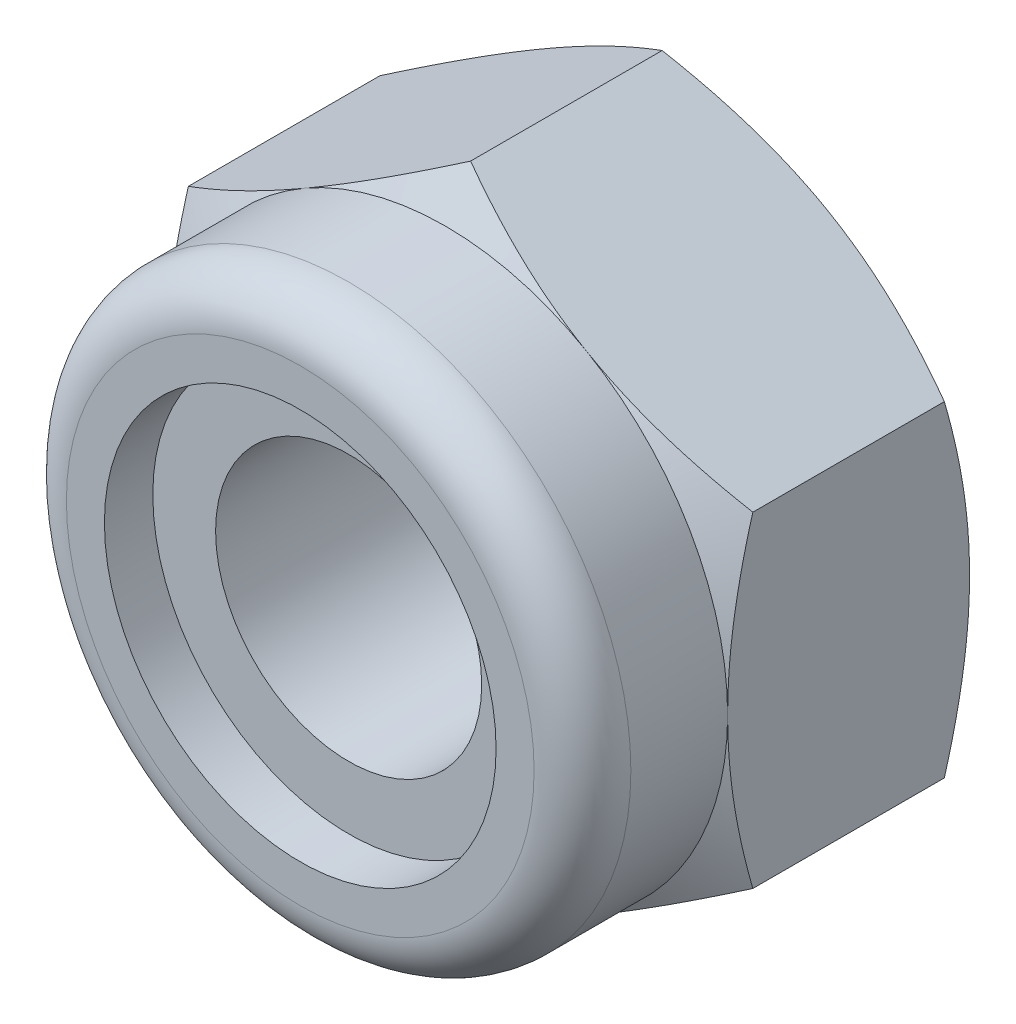
ISO-10303-21;
HEADER;
FILE_DESCRIPTION(('STEP AP214'),'2;1');
FILE_NAME('part.step','',(''),(''),'','','');
FILE_SCHEMA(('AUTOMOTIVE_DESIGN { 1 0 10303 214 1 1 1 1 }'));
ENDSEC;
DATA;
#1=APPLICATION_CONTEXT('core data for automotive mechanical design processes');
#2=APPLICATION_PROTOCOL_DEFINITION('international standard','automotive_design',2000,#1);
#3=PRODUCT_CONTEXT('',#1,'mechanical');
#4=PRODUCT('Part','Part','',(#3));
#5=PRODUCT_RELATED_PRODUCT_CATEGORY('part','',(#4));
#6=PRODUCT_DEFINITION_FORMATION('','',#4);
#7=PRODUCT_DEFINITION_CONTEXT('part definition',#1,'design');
#8=PRODUCT_DEFINITION('design','',#6,#7);
#9=PRODUCT_DEFINITION_SHAPE('','',#8);
#10=(LENGTH_UNIT() NAMED_UNIT(*) SI_UNIT(.MILLI.,.METRE.));
#11=(NAMED_UNIT(*) PLANE_ANGLE_UNIT() SI_UNIT($,.RADIAN.));
#12=(NAMED_UNIT(*) SI_UNIT($,.STERADIAN.) SOLID_ANGLE_UNIT());
#13=UNCERTAINTY_MEASURE_WITH_UNIT(LENGTH_MEASURE(1.E-05),#10,'distance_accuracy_value','');
#14=(GEOMETRIC_REPRESENTATION_CONTEXT(3) GLOBAL_UNCERTAINTY_ASSIGNED_CONTEXT((#13)) GLOBAL_UNIT_ASSIGNED_CONTEXT((#10,
#11,#12)) REPRESENTATION_CONTEXT('',''));
#15=CARTESIAN_POINT('',(0.,0.,0.));
#16=DIRECTION('',(0.,0.,1.));
#17=DIRECTION('',(1.,0.,0.));
#18=AXIS2_PLACEMENT_3D('',#15,#16,#17);
#19=CARTESIAN_POINT('',(-7.,0.,-3.));
#20=DIRECTION('',(0.,0.,1.));
#21=DIRECTION('',(1.,0.,0.));
#22=AXIS2_PLACEMENT_3D('',#19,#20,#21);
#23=PLANE('',#22);
#24=CARTESIAN_POINT('',(0.,0.,-3.));
#25=DIRECTION('',(0.,0.,1.));
#26=DIRECTION('',(1.,0.,0.));
#27=AXIS2_PLACEMENT_3D('',#24,#25,#26);
#28=CIRCLE('',#27,2.);
#29=CARTESIAN_POINT('',(2.,0.,-3.));
#30=VERTEX_POINT('',#29);
#31=EDGE_CURVE('E405',#30,#30,#28,.T.);
#32=ORIENTED_EDGE('',*,*,#31,.T.);
#33=EDGE_LOOP('',(#32));
#34=FACE_BOUND('',#33,.T.);
#35=CARTESIAN_POINT('',(0.,0.,-3.));
#36=DIRECTION('',(0.,0.,1.));
#37=DIRECTION('',(1.,0.,0.));
#38=AXIS2_PLACEMENT_3D('',#35,#36,#37);
#39=CIRCLE('',#38,3.5);
#40=CARTESIAN_POINT('',(3.5,0.,-3.));
#41=VERTEX_POINT('',#40);
#42=CARTESIAN_POINT('',(1.75,3.03108891324554,-3.));
#43=VERTEX_POINT('',#42);
#44=EDGE_CURVE('E409',#41,#43,#39,.T.);
#45=ORIENTED_EDGE('',*,*,#44,.F.);
#46=CARTESIAN_POINT('',(0.,0.,-3.));
#47=DIRECTION('',(0.,0.,1.));
#48=DIRECTION('',(1.,0.,0.));
#49=AXIS2_PLACEMENT_3D('',#46,#47,#48);
#50=CIRCLE('',#49,3.5);
#51=CARTESIAN_POINT('',(1.75,-3.03108891324554,-3.));
#52=VERTEX_POINT('',#51);
#53=EDGE_CURVE('E62',#41,#52,#50,.F.);
#54=ORIENTED_EDGE('',*,*,#53,.T.);
#55=CARTESIAN_POINT('',(-1.75,-3.03108891324554,-3.));
#56=VERTEX_POINT('',#55);
#57=EDGE_CURVE('E733',#52,#56,#50,.F.);
#58=ORIENTED_EDGE('',*,*,#57,.T.);
#59=CARTESIAN_POINT('',(-3.5,0.,-3.));
#60=VERTEX_POINT('',#59);
#61=EDGE_CURVE('E736',#56,#60,#50,.F.);
#62=ORIENTED_EDGE('',*,*,#61,.T.);
#63=CARTESIAN_POINT('',(-1.75,3.03108891324554,-3.));
#64=VERTEX_POINT('',#63);
#65=EDGE_CURVE('E739',#60,#64,#50,.F.);
#66=ORIENTED_EDGE('',*,*,#65,.T.);
#67=EDGE_CURVE('E220',#64,#43,#50,.F.);
#68=ORIENTED_EDGE('',*,*,#67,.T.);
#69=EDGE_LOOP('',(#45,#54,#58,#62,#66,#68));
#70=FACE_BOUND('',#69,.T.);
#71=ADVANCED_FACE('F39',(#34,#70),#23,.F.);
#72=CARTESIAN_POINT('',(0.,4.04145188432738,-3.));
#73=DIRECTION('',(-0.5,0.866025403784438,0.));
#74=DIRECTION('',(-0.866025403784439,-0.5,0.));
#75=AXIS2_PLACEMENT_3D('',#72,#73,#74);
#76=PLANE('',#75);
#77=DIRECTION('',(0.,0.,1.));
#78=VECTOR('',#77,1.);
#79=CARTESIAN_POINT('',(-3.5,2.02072594216369,-3.));
#80=LINE('',#79,#78);
#81=CARTESIAN_POINT('',(-3.5,2.02072594216369,-2.68739260883036));
#82=VERTEX_POINT('',#81);
#83=CARTESIAN_POINT('',(-3.5,2.02072594216369,-0.312607391169644));
#84=VERTEX_POINT('',#83);
#85=EDGE_CURVE('E247',#82,#84,#80,.T.);
#86=ORIENTED_EDGE('',*,*,#85,.T.);
#87=CARTESIAN_POINT('',(-3.5002,2.02061047210985,-0.312674060693372));
#88=CARTESIAN_POINT('',(-3.34639282154755,2.10941108799267,-0.261385788989985));
#89=CARTESIAN_POINT('',(-3.19125798916558,2.19897822522909,-0.214740953816198));
#90=CARTESIAN_POINT('',(-2.87830199342322,2.37966345361545,-0.13332187553335));
#91=CARTESIAN_POINT('',(-2.72047526921251,2.47078475532382,-0.0985764355845621));
#92=CARTESIAN_POINT('',(-2.40677778961987,2.65189807961074,-0.0444900271828369));
#93=CARTESIAN_POINT('',(-2.25095530083931,2.74186223545399,-0.0247890862603827));
#94=CARTESIAN_POINT('',(-1.93857711279463,2.92221386641056,-0.00127013273725483));
#95=CARTESIAN_POINT('',(-1.78202254896577,3.01260068598001,0.00256735545443531));
#96=CARTESIAN_POINT('',(-1.48949078007901,3.1814939814933,-0.00541530187697747));
#97=CARTESIAN_POINT('',(-1.35346978754209,3.26002573814993,-0.015275434069608));
#98=CARTESIAN_POINT('',(-1.08231397971101,3.41657761679354,-0.0465264668994054));
#99=CARTESIAN_POINT('',(-0.947180102315317,3.49459719728458,-0.0679280432857999));
#100=CARTESIAN_POINT('',(-0.675465207594816,3.65147186489429,-0.121430407880579));
#101=CARTESIAN_POINT('',(-0.538918580721665,3.73030709667644,-0.153757994445089));
#102=CARTESIAN_POINT('',(-0.267861907055498,3.88680174018325,-0.227128933807996));
#103=CARTESIAN_POINT('',(-0.133348387531463,3.96446315689009,-0.268155046569869));
#104=CARTESIAN_POINT('',(0.000200000000000749,4.04156735438122,-0.312674060693373));
#105=B_SPLINE_CURVE_WITH_KNOTS('',3,(#87,#88,#89,#90,#91,#92,#93,#94,#95,#96,#97,#98,#99,#100,
#101,#102,#103,#104),.UNSPECIFIED.,.F.,.F.,(4,2,2,2,2,2,2,2,4),(0.,0.554793832886254,
1.11092123814984,1.65328467083219,2.19498204478403,2.6666513085086,3.13875761298268,
3.6213361260051,4.10296698719187),.UNSPECIFIED.);
#106=CARTESIAN_POINT('',(-1.75,3.03108891324554,0.));
#107=VERTEX_POINT('',#106);
#108=EDGE_CURVE('E54',#84,#107,#105,.T.);
#109=ORIENTED_EDGE('',*,*,#108,.T.);
#110=CARTESIAN_POINT('',(0.,4.04145188432738,-0.312607391169645));
#111=VERTEX_POINT('',#110);
#112=EDGE_CURVE('E378',#107,#111,#105,.T.);
#113=ORIENTED_EDGE('',*,*,#112,.T.);
#114=DIRECTION('',(0.,0.,1.));
#115=VECTOR('',#114,1.);
#116=CARTESIAN_POINT('',(0.,4.04145188432738,-3.));
#117=LINE('',#116,#115);
#118=CARTESIAN_POINT('',(0.,4.04145188432738,-2.68739260883036));
#119=VERTEX_POINT('',#118);
#120=EDGE_CURVE('E215',#119,#111,#117,.T.);
#121=ORIENTED_EDGE('',*,*,#120,.F.);
#122=CARTESIAN_POINT('',(-3.5002,2.02061047210985,-2.68732593930663));
#123=CARTESIAN_POINT('',(-3.34639282154755,2.10941108799267,-2.73861421101002));
#124=CARTESIAN_POINT('',(-3.19125798916558,2.19897822522909,-2.7852590461838));
#125=CARTESIAN_POINT('',(-2.87830199342322,2.37966345361545,-2.86667812446665));
#126=CARTESIAN_POINT('',(-2.7204752692125,2.47078475532382,-2.90142356441544));
#127=CARTESIAN_POINT('',(-2.40677778961987,2.65189807961074,-2.95550997281716));
#128=CARTESIAN_POINT('',(-2.25095530083931,2.74186223545399,-2.97521091373962));
#129=CARTESIAN_POINT('',(-1.93857711279463,2.92221386641056,-2.99872986726275));
#130=CARTESIAN_POINT('',(-1.78202254896577,3.01260068598001,-3.00256735545444));
#131=CARTESIAN_POINT('',(-1.48949078007901,3.1814939814933,-2.99458469812303));
#132=CARTESIAN_POINT('',(-1.35346978754209,3.26002573814993,-2.98472456593039));
#133=CARTESIAN_POINT('',(-1.08231397971101,3.41657761679354,-2.95347353310059));
#134=CARTESIAN_POINT('',(-0.947180102315317,3.49459719728458,-2.9320719567142));
#135=CARTESIAN_POINT('',(-0.675465207594816,3.65147186489429,-2.87856959211942));
#136=CARTESIAN_POINT('',(-0.538918580721664,3.73030709667644,-2.84624200555491));
#137=CARTESIAN_POINT('',(-0.267861907055498,3.88680174018325,-2.772871066192));
#138=CARTESIAN_POINT('',(-0.133348387531463,3.96446315689009,-2.73184495343013));
#139=CARTESIAN_POINT('',(0.000200000000001377,4.04156735438122,-2.68732593930662));
#140=B_SPLINE_CURVE_WITH_KNOTS('',3,(#122,#123,#124,#125,#126,#127,#128,#129,#130,#131,#132,
#133,#134,#135,#136,#137,#138,#139),.UNSPECIFIED.,.F.,.F.,(4,2,2,2,2,2,2,2,4),(0.,
0.554793832886254,1.11092123814984,1.65328467083219,2.19498204478403,2.6666513085086,
3.13875761298268,3.6213361260051,4.10296698719187),.UNSPECIFIED.);
#141=EDGE_CURVE('E250',#64,#119,#140,.T.);
#142=ORIENTED_EDGE('',*,*,#141,.F.);
#143=EDGE_CURVE('E257',#82,#64,#140,.T.);
#144=ORIENTED_EDGE('',*,*,#143,.F.);
#145=EDGE_LOOP('',(#86,#109,#113,#121,#142,#144));
#146=FACE_BOUND('',#145,.T.);
#147=ADVANCED_FACE('F389',(#146),#76,.T.);
#148=CARTESIAN_POINT('',(3.5,2.02072594216368,-3.));
#149=DIRECTION('',(0.5,0.866025403784438,0.));
#150=DIRECTION('',(-0.866025403784438,0.5,0.));
#151=AXIS2_PLACEMENT_3D('',#148,#149,#150);
#152=PLANE('',#151);
#153=ORIENTED_EDGE('',*,*,#120,.T.);
#154=CARTESIAN_POINT('',(-0.000199999999999165,4.04156735438122,-0.312674060693373));
#155=CARTESIAN_POINT('',(0.153607178452449,3.9527667384984,-0.261385788989983));
#156=CARTESIAN_POINT('',(0.308742010834422,3.86319960126198,-0.214740953816196));
#157=CARTESIAN_POINT('',(0.621698006576779,3.68251437287562,-0.133321875533347));
#158=CARTESIAN_POINT('',(0.779524730787495,3.59139307116725,-0.0985764355845593));
#159=CARTESIAN_POINT('',(1.09322221038013,3.41027974688033,-0.0444900271828337));
#160=CARTESIAN_POINT('',(1.24904469916069,3.32031559103708,-0.0247890862603786));
#161=CARTESIAN_POINT('',(1.56142288720537,3.13996396008051,-0.00127013273725219));
#162=CARTESIAN_POINT('',(1.71797745103423,3.04957714051106,0.00256735545443563));
#163=CARTESIAN_POINT('',(2.01050921992099,2.88068384499777,-0.00541530187697691));
#164=CARTESIAN_POINT('',(2.14653021245791,2.80215208834114,-0.0152754340696054));
#165=CARTESIAN_POINT('',(2.41768602028899,2.64560020969753,-0.0465264668994011));
#166=CARTESIAN_POINT('',(2.55281989768468,2.56758062920649,-0.0679280432857959));
#167=CARTESIAN_POINT('',(2.82453479240518,2.41070596159678,-0.121430407880575));
#168=CARTESIAN_POINT('',(2.96108141927833,2.33187072981463,-0.153757994445085));
#169=CARTESIAN_POINT('',(3.2321380929445,2.17537608630782,-0.227128933807992));
#170=CARTESIAN_POINT('',(3.36665161246854,2.09771466960098,-0.268155046569865));
#171=CARTESIAN_POINT('',(3.5002,2.02061047210985,-0.312674060693371));
#172=B_SPLINE_CURVE_WITH_KNOTS('',3,(#154,#155,#156,#157,#158,#159,#160,#161,#162,#163,#164,
#165,#166,#167,#168,#169,#170,#171),.UNSPECIFIED.,.F.,.F.,(4,2,2,2,2,2,2,2,4),(0.,
0.554793832886255,1.11092123814984,1.65328467083219,2.19498204478403,2.6666513085086,
3.13875761298267,3.6213361260051,4.10296698719187),.UNSPECIFIED.);
#173=CARTESIAN_POINT('',(1.75,3.03108891324554,0.));
#174=VERTEX_POINT('',#173);
#175=EDGE_CURVE('E420',#111,#174,#172,.T.);
#176=ORIENTED_EDGE('',*,*,#175,.T.);
#177=CARTESIAN_POINT('',(3.5,2.02072594216369,-0.312607391169645));
#178=VERTEX_POINT('',#177);
#179=EDGE_CURVE('E383',#174,#178,#172,.T.);
#180=ORIENTED_EDGE('',*,*,#179,.T.);
#181=DIRECTION('',(0.,0.,1.));
#182=VECTOR('',#181,1.);
#183=CARTESIAN_POINT('',(3.5,2.02072594216368,-3.));
#184=LINE('',#183,#182);
#185=CARTESIAN_POINT('',(3.5,2.02072594216369,-2.68739260883036));
#186=VERTEX_POINT('',#185);
#187=EDGE_CURVE('E221',#186,#178,#184,.T.);
#188=ORIENTED_EDGE('',*,*,#187,.F.);
#189=CARTESIAN_POINT('',(-0.000199999999999076,4.04156735438122,-2.68732593930662));
#190=CARTESIAN_POINT('',(0.153607178452448,3.9527667384984,-2.73861421101002));
#191=CARTESIAN_POINT('',(0.308742010834422,3.86319960126198,-2.7852590461838));
#192=CARTESIAN_POINT('',(0.621698006576779,3.68251437287562,-2.86667812446665));
#193=CARTESIAN_POINT('',(0.779524730787495,3.59139307116725,-2.90142356441544));
#194=CARTESIAN_POINT('',(1.09322221038013,3.41027974688033,-2.95550997281717));
#195=CARTESIAN_POINT('',(1.24904469916069,3.32031559103707,-2.97521091373962));
#196=CARTESIAN_POINT('',(1.56142288720537,3.13996396008051,-2.99872986726275));
#197=CARTESIAN_POINT('',(1.71797745103423,3.04957714051106,-3.00256735545444));
#198=CARTESIAN_POINT('',(2.01050921992099,2.88068384499777,-2.99458469812303));
#199=CARTESIAN_POINT('',(2.14653021245791,2.80215208834114,-2.9847245659304));
#200=CARTESIAN_POINT('',(2.41768602028899,2.64560020969753,-2.9534735331006));
#201=CARTESIAN_POINT('',(2.55281989768468,2.56758062920649,-2.9320719567142));
#202=CARTESIAN_POINT('',(2.82453479240518,2.41070596159678,-2.87856959211943));
#203=CARTESIAN_POINT('',(2.96108141927834,2.33187072981463,-2.84624200555492));
#204=CARTESIAN_POINT('',(3.2321380929445,2.17537608630782,-2.77287106619201));
#205=CARTESIAN_POINT('',(3.36665161246854,2.09771466960098,-2.73184495343013));
#206=CARTESIAN_POINT('',(3.5002,2.02061047210985,-2.68732593930663));
#207=B_SPLINE_CURVE_WITH_KNOTS('',3,(#189,#190,#191,#192,#193,#194,#195,#196,#197,#198,#199,
#200,#201,#202,#203,#204,#205,#206),.UNSPECIFIED.,.F.,.F.,(4,2,2,2,2,2,2,2,4),(0.,
0.554793832886255,1.11092123814984,1.65328467083219,2.19498204478403,2.6666513085086,
3.13875761298268,3.6213361260051,4.10296698719188),.UNSPECIFIED.);
#208=EDGE_CURVE('E222',#43,#186,#207,.T.);
#209=ORIENTED_EDGE('',*,*,#208,.F.);
#210=EDGE_CURVE('E256',#119,#43,#207,.T.);
#211=ORIENTED_EDGE('',*,*,#210,.F.);
#212=EDGE_LOOP('',(#153,#176,#180,#188,#209,#211));
#213=FACE_BOUND('',#212,.T.);
#214=ADVANCED_FACE('F392',(#213),#152,.T.);
#215=CARTESIAN_POINT('',(3.5,2.02072594216368,-3.));
#216=DIRECTION('',(-1.,0.,0.));
#217=DIRECTION('',(0.,0.,1.));
#218=AXIS2_PLACEMENT_3D('',#215,#216,#217);
#219=PLANE('',#218);
#220=CARTESIAN_POINT('',(3.5,-5.35926299121406,-1.67484346858556));
#221=CARTESIAN_POINT('',(3.5,-5.20559319908842,-1.60058173692104));
#222=CARTESIAN_POINT('',(3.5,-5.05156008083376,-1.52705822833147));
#223=CARTESIAN_POINT('',(3.5,-4.74257074180711,-1.38190950344752));
#224=CARTESIAN_POINT('',(3.5,-4.58761436682437,-1.31028461582133));
#225=CARTESIAN_POINT('',(3.5,-4.27574500225542,-1.16897765517624));
#226=CARTESIAN_POINT('',(3.5,-4.11882589028192,-1.09930904568016));
#227=CARTESIAN_POINT('',(3.5,-3.80369792903856,-0.962964262242761));
#228=CARTESIAN_POINT('',(3.5,-3.64548914750596,-0.896287932319519));
#229=CARTESIAN_POINT('',(3.5,-3.32556618401856,-0.765931819095068));
#230=CARTESIAN_POINT('',(3.5,-3.16383281219924,-0.702298873688865));
#231=CARTESIAN_POINT('',(3.5,-2.83845840945598,-0.580016702089493));
#232=CARTESIAN_POINT('',(3.5,-2.67481716858826,-0.521368030370692));
#233=CARTESIAN_POINT('',(3.5,-2.34570278472049,-0.410630279877022));
#234=CARTESIAN_POINT('',(3.5,-2.18023438248743,-0.358527255435858));
#235=CARTESIAN_POINT('',(3.5,-1.8469452280637,-0.262572936976444));
#236=CARTESIAN_POINT('',(3.5,-1.6791252378753,-0.218719033467158));
#237=CARTESIAN_POINT('',(3.5,-1.34101828610925,-0.141391945584787));
#238=CARTESIAN_POINT('',(3.5,-1.17073068027694,-0.107921525211973));
#239=CARTESIAN_POINT('',(3.5,-0.828102385138487,-0.0536149564320508));
#240=CARTESIAN_POINT('',(3.5,-0.655761694017304,-0.0327788191952369));
#241=CARTESIAN_POINT('',(3.5,-0.311020490924452,-0.00558408650575708));
#242=CARTESIAN_POINT('',(3.5,-0.138627397207261,0.000866163165910895));
#243=CARTESIAN_POINT('',(3.5,0.206038074906534,-0.00105355807794623));
#244=CARTESIAN_POINT('',(3.5,0.378310473023179,-0.00941968196343176));
#245=CARTESIAN_POINT('',(3.5,0.672490555822326,-0.0357688927868919));
#246=CARTESIAN_POINT('',(3.5,0.794722791084091,-0.0503206340384213));
#247=CARTESIAN_POINT('',(3.5,1.0382430543056,-0.0859367340533556));
#248=CARTESIAN_POINT('',(3.5,1.15953093025886,-0.107002119926141));
#249=CARTESIAN_POINT('',(3.5,1.52187914771348,-0.178863187081452));
#250=CARTESIAN_POINT('',(3.5,1.76124104212632,-0.23830527562201));
#251=CARTESIAN_POINT('',(3.5,2.11940971387708,-0.340826814402553));
#252=CARTESIAN_POINT('',(3.5,2.24008344316346,-0.377749699085182));
#253=CARTESIAN_POINT('',(3.5,2.48017139213728,-0.455249007699292));
#254=CARTESIAN_POINT('',(3.5,2.59958641795613,-0.495822911663549));
#255=CARTESIAN_POINT('',(3.5,2.83665760451798,-0.579779986782751));
#256=CARTESIAN_POINT('',(3.5,2.95431988203483,-0.623146060034312));
#257=CARTESIAN_POINT('',(3.5,3.188731535088,-0.712423559566864));
#258=CARTESIAN_POINT('',(3.5,3.30548051959464,-0.758336014592948));
#259=CARTESIAN_POINT('',(3.5,3.42180736613349,-0.80527038072407));
#260=B_SPLINE_CURVE_WITH_KNOTS('',3,(#220,#221,#222,#223,#224,#225,#226,#227,#228,#229,#230,
#231,#232,#233,#234,#235,#236,#237,#238,#239,#240,#241,#242,#243,#244,#245,#246,#247,#248,#249,
#250,#251,#252,#253,#254,#255,#256,#257,#258,#259),.UNSPECIFIED.,.F.,.F.,(4,2,2,2,2,2,2,2,2,2,2,
2,2,2,2,2,2,2,2,4),(0.,0.512025318465738,1.02413870177436,1.53918270315241,2.05419982499224,
2.57553975872798,3.09693761309353,3.61720506610401,4.13730766217537,4.65754858684365,
5.17778997146961,5.69470725122282,6.21149033452401,6.58059623222332,6.94976036239485,
7.68863804939851,8.06719621660478,8.44549507476761,8.82166461280099,9.19798724733411),.UNSPECIFIED.);
#261=CARTESIAN_POINT('',(3.5,-2.02072594216369,-0.312607391169645));
#262=VERTEX_POINT('',#261);
#263=CARTESIAN_POINT('',(3.5,0.,0.));
#264=VERTEX_POINT('',#263);
#265=EDGE_CURVE('E377',#262,#264,#260,.T.);
#266=ORIENTED_EDGE('',*,*,#265,.F.);
#267=DIRECTION('',(0.,0.,1.));
#268=VECTOR('',#267,1.);
#269=CARTESIAN_POINT('',(3.5,-2.02072594216369,-3.));
#270=LINE('',#269,#268);
#271=CARTESIAN_POINT('',(3.5,-2.02072594216369,-2.68739260883036));
#272=VERTEX_POINT('',#271);
#273=EDGE_CURVE('E233',#272,#262,#270,.T.);
#274=ORIENTED_EDGE('',*,*,#273,.F.);
#275=CARTESIAN_POINT('',(3.5,-5.35926299121406,-1.32515653141443));
#276=CARTESIAN_POINT('',(3.5,-5.20559319908842,-1.39941826307896));
#277=CARTESIAN_POINT('',(3.5,-5.05156008083376,-1.47294177166852));
#278=CARTESIAN_POINT('',(3.5,-4.74257074180711,-1.61809049655248));
#279=CARTESIAN_POINT('',(3.5,-4.58761436682437,-1.68971538417867));
#280=CARTESIAN_POINT('',(3.5,-4.27574500225543,-1.83102234482376));
#281=CARTESIAN_POINT('',(3.5,-4.11882589028192,-1.90069095431984));
#282=CARTESIAN_POINT('',(3.5,-3.80369792903856,-2.03703573775724));
#283=CARTESIAN_POINT('',(3.5,-3.64548914750596,-2.10371206768048));
#284=CARTESIAN_POINT('',(3.5,-3.32556618401856,-2.23406818090493));
#285=CARTESIAN_POINT('',(3.5,-3.16383281219924,-2.29770112631113));
#286=CARTESIAN_POINT('',(3.5,-2.83845840945598,-2.41998329791051));
#287=CARTESIAN_POINT('',(3.5,-2.67481716858826,-2.47863196962931));
#288=CARTESIAN_POINT('',(3.5,-2.34570278472049,-2.58936972012298));
#289=CARTESIAN_POINT('',(3.5,-2.18023438248743,-2.64147274456414));
#290=CARTESIAN_POINT('',(3.5,-1.8469452280637,-2.73742706302356));
#291=CARTESIAN_POINT('',(3.5,-1.6791252378753,-2.78128096653284));
#292=CARTESIAN_POINT('',(3.5,-1.34101828610925,-2.85860805441521));
#293=CARTESIAN_POINT('',(3.5,-1.17073068027694,-2.89207847478803));
#294=CARTESIAN_POINT('',(3.5,-0.828102385138487,-2.94638504356795));
#295=CARTESIAN_POINT('',(3.5,-0.655761694017305,-2.96722118080476));
#296=CARTESIAN_POINT('',(3.5,-0.311020490924451,-2.99441591349424));
#297=CARTESIAN_POINT('',(3.5,-0.138627397207261,-3.00086616316591));
#298=CARTESIAN_POINT('',(3.5,0.206038074906534,-2.99894644192205));
#299=CARTESIAN_POINT('',(3.5,0.378310473023179,-2.99058031803657));
#300=CARTESIAN_POINT('',(3.5,0.672490555822327,-2.96423110721311));
#301=CARTESIAN_POINT('',(3.5,0.794722791084091,-2.94967936596158));
#302=CARTESIAN_POINT('',(3.5,1.0382430543056,-2.91406326594665));
#303=CARTESIAN_POINT('',(3.5,1.15953093025886,-2.89299788007386));
#304=CARTESIAN_POINT('',(3.5,1.52187914771348,-2.82113681291855));
#305=CARTESIAN_POINT('',(3.5,1.76124104212632,-2.76169472437799));
#306=CARTESIAN_POINT('',(3.5,2.11940971387708,-2.65917318559745));
#307=CARTESIAN_POINT('',(3.5,2.24008344316346,-2.62225030091482));
#308=CARTESIAN_POINT('',(3.5,2.48017139213728,-2.54475099230071));
#309=CARTESIAN_POINT('',(3.5,2.59958641795612,-2.50417708833645));
#310=CARTESIAN_POINT('',(3.5,2.83665760451798,-2.42022001321725));
#311=CARTESIAN_POINT('',(3.5,2.95431988203483,-2.37685393996569));
#312=CARTESIAN_POINT('',(3.5,3.18873153508799,-2.28757644043314));
#313=CARTESIAN_POINT('',(3.5,3.30548051959463,-2.24166398540705));
#314=CARTESIAN_POINT('',(3.5,3.42180736613348,-2.19472961927593));
#315=B_SPLINE_CURVE_WITH_KNOTS('',3,(#275,#276,#277,#278,#279,#280,#281,#282,#283,#284,#285,
#286,#287,#288,#289,#290,#291,#292,#293,#294,#295,#296,#297,#298,#299,#300,#301,#302,#303,#304,
#305,#306,#307,#308,#309,#310,#311,#312,#313,#314),.UNSPECIFIED.,.F.,.F.,(4,2,2,2,2,2,2,2,2,2,2,
2,2,2,2,2,2,2,2,4),(0.,0.512025318465738,1.02413870177436,1.53918270315241,2.05419982499224,
2.57553975872798,3.09693761309353,3.61720506610401,4.13730766217537,4.65754858684365,
5.17778997146962,5.69470725122283,6.21149033452401,6.58059623222332,6.94976036239485,
7.68863804939851,8.06719621660478,8.4454950747676,8.82166461280099,9.1979872473341),.UNSPECIFIED.);
#316=EDGE_CURVE('E271',#272,#41,#315,.T.);
#317=ORIENTED_EDGE('',*,*,#316,.T.);
#318=EDGE_CURVE('E270',#41,#186,#315,.T.);
#319=ORIENTED_EDGE('',*,*,#318,.T.);
#320=ORIENTED_EDGE('',*,*,#187,.T.);
#321=EDGE_CURVE('E376',#264,#178,#260,.T.);
#322=ORIENTED_EDGE('',*,*,#321,.F.);
#323=EDGE_LOOP('',(#266,#274,#317,#319,#320,#322));
#324=FACE_BOUND('',#323,.T.);
#325=ADVANCED_FACE('F299',(#324),#219,.F.);
#326=CARTESIAN_POINT('',(0.,-4.04145188432739,-3.));
#327=DIRECTION('',(0.5,-0.866025403784438,0.));
#328=DIRECTION('',(0.866025403784439,0.5,0.));
#329=AXIS2_PLACEMENT_3D('',#326,#327,#328);
#330=PLANE('',#329);
#331=ORIENTED_EDGE('',*,*,#273,.T.);
#332=CARTESIAN_POINT('',(3.5002,-2.02061047210986,-0.312674060693373));
#333=CARTESIAN_POINT('',(3.34639282154755,-2.10941108799268,-0.261385788989986));
#334=CARTESIAN_POINT('',(3.19125798916558,-2.1989782252291,-0.214740953816199));
#335=CARTESIAN_POINT('',(2.87830199342322,-2.37966345361546,-0.133321875533351));
#336=CARTESIAN_POINT('',(2.7204752692125,-2.47078475532383,-0.098576435584564));
#337=CARTESIAN_POINT('',(2.40677778961987,-2.65189807961074,-0.0444900271828391));
#338=CARTESIAN_POINT('',(2.25095530083931,-2.741862235454,-0.0247890862603849));
#339=CARTESIAN_POINT('',(1.93857711279462,-2.92221386641056,-0.0012701327372574));
#340=CARTESIAN_POINT('',(1.78202254896577,-3.01260068598002,0.00256735545443238));
#341=CARTESIAN_POINT('',(1.48949078007901,-3.18149398149331,-0.00541530187698076));
#342=CARTESIAN_POINT('',(1.35346978754209,-3.26002573814994,-0.0152754340696112));
#343=CARTESIAN_POINT('',(1.082313979711,-3.41657761679355,-0.0465264668994086));
#344=CARTESIAN_POINT('',(0.947180102315316,-3.49459719728458,-0.0679280432858032));
#345=CARTESIAN_POINT('',(0.675465207594815,-3.6514718648943,-0.121430407880582));
#346=CARTESIAN_POINT('',(0.538918580721664,-3.73030709667645,-0.153757994445092));
#347=CARTESIAN_POINT('',(0.267861907055498,-3.88680174018325,-0.227128933808));
#348=CARTESIAN_POINT('',(0.133348387531463,-3.96446315689009,-0.268155046569872));
#349=CARTESIAN_POINT('',(-0.000200000000000494,-4.04156735438123,-0.312674060693376));
#350=B_SPLINE_CURVE_WITH_KNOTS('',3,(#332,#333,#334,#335,#336,#337,#338,#339,#340,#341,#342,
#343,#344,#345,#346,#347,#348,#349),.UNSPECIFIED.,.F.,.F.,(4,2,2,2,2,2,2,2,4),(0.,
0.554793832886254,1.11092123814984,1.65328467083219,2.19498204478403,2.6666513085086,
3.13875761298267,3.6213361260051,4.10296698719187),.UNSPECIFIED.);
#351=CARTESIAN_POINT('',(1.75,-3.03108891324554,0.));
#352=VERTEX_POINT('',#351);
#353=EDGE_CURVE('E712',#262,#352,#350,.T.);
#354=ORIENTED_EDGE('',*,*,#353,.T.);
#355=CARTESIAN_POINT('',(0.,-4.04145188432738,-0.312607391169645));
#356=VERTEX_POINT('',#355);
#357=EDGE_CURVE('E356',#352,#356,#350,.T.);
#358=ORIENTED_EDGE('',*,*,#357,.T.);
#359=DIRECTION('',(0.,0.,1.));
#360=VECTOR('',#359,1.);
#361=CARTESIAN_POINT('',(0.,-4.04145188432739,-3.));
#362=LINE('',#361,#360);
#363=CARTESIAN_POINT('',(0.,-4.04145188432738,-2.68739260883036));
#364=VERTEX_POINT('',#363);
#365=EDGE_CURVE('E238',#364,#356,#362,.T.);
#366=ORIENTED_EDGE('',*,*,#365,.F.);
#367=CARTESIAN_POINT('',(3.5002,-2.02061047210986,-2.68732593930662));
#368=CARTESIAN_POINT('',(3.34639282154755,-2.10941108799268,-2.73861421101001));
#369=CARTESIAN_POINT('',(3.19125798916558,-2.1989782252291,-2.7852590461838));
#370=CARTESIAN_POINT('',(2.87830199342322,-2.37966345361546,-2.86667812446665));
#371=CARTESIAN_POINT('',(2.7204752692125,-2.47078475532383,-2.90142356441544));
#372=CARTESIAN_POINT('',(2.40677778961987,-2.65189807961074,-2.95550997281716));
#373=CARTESIAN_POINT('',(2.25095530083931,-2.741862235454,-2.97521091373962));
#374=CARTESIAN_POINT('',(1.93857711279462,-2.92221386641056,-2.99872986726274));
#375=CARTESIAN_POINT('',(1.78202254896577,-3.01260068598002,-3.00256735545443));
#376=CARTESIAN_POINT('',(1.48949078007901,-3.18149398149331,-2.99458469812302));
#377=CARTESIAN_POINT('',(1.35346978754209,-3.26002573814994,-2.98472456593039));
#378=CARTESIAN_POINT('',(1.082313979711,-3.41657761679355,-2.95347353310059));
#379=CARTESIAN_POINT('',(0.947180102315316,-3.49459719728458,-2.9320719567142));
#380=CARTESIAN_POINT('',(0.675465207594815,-3.6514718648943,-2.87856959211942));
#381=CARTESIAN_POINT('',(0.538918580721664,-3.73030709667645,-2.84624200555491));
#382=CARTESIAN_POINT('',(0.267861907055499,-3.88680174018325,-2.772871066192));
#383=CARTESIAN_POINT('',(0.133348387531464,-3.96446315689009,-2.73184495343013));
#384=CARTESIAN_POINT('',(-0.000200000000000603,-4.04156735438123,-2.68732593930662));
#385=B_SPLINE_CURVE_WITH_KNOTS('',3,(#367,#368,#369,#370,#371,#372,#373,#374,#375,#376,#377,
#378,#379,#380,#381,#382,#383,#384),.UNSPECIFIED.,.F.,.F.,(4,2,2,2,2,2,2,2,4),(0.,
0.554793832886254,1.11092123814984,1.65328467083219,2.19498204478403,2.6666513085086,
3.13875761298267,3.6213361260051,4.10296698719187),.UNSPECIFIED.);
#386=EDGE_CURVE('E284',#52,#364,#385,.T.);
#387=ORIENTED_EDGE('',*,*,#386,.F.);
#388=EDGE_CURVE('E279',#272,#52,#385,.T.);
#389=ORIENTED_EDGE('',*,*,#388,.F.);
#390=EDGE_LOOP('',(#331,#354,#358,#366,#387,#389));
#391=FACE_BOUND('',#390,.T.);
#392=ADVANCED_FACE('F339',(#391),#330,.T.);
#393=CARTESIAN_POINT('',(-3.5,-2.02072594216369,-3.));
#394=DIRECTION('',(-0.5,-0.866025403784438,0.));
#395=DIRECTION('',(0.866025403784438,-0.5,0.));
#396=AXIS2_PLACEMENT_3D('',#393,#394,#395);
#397=PLANE('',#396);
#398=ORIENTED_EDGE('',*,*,#365,.T.);
#399=CARTESIAN_POINT('',(0.000199999999999464,-4.04156735438123,-0.312674060693376));
#400=CARTESIAN_POINT('',(-0.15360717845245,-3.95276673849841,-0.261385788989988));
#401=CARTESIAN_POINT('',(-0.308742010834424,-3.86319960126199,-0.214740953816201));
#402=CARTESIAN_POINT('',(-0.621698006576782,-3.68251437287563,-0.133321875533352));
#403=CARTESIAN_POINT('',(-0.779524730787497,-3.59139307116725,-0.0985764355845647));
#404=CARTESIAN_POINT('',(-1.09322221038013,-3.41027974688034,-0.0444900271828391));
#405=CARTESIAN_POINT('',(-1.24904469916069,-3.32031559103708,-0.0247890862603841));
#406=CARTESIAN_POINT('',(-1.56142288720538,-3.13996396008052,-0.00127013273725649));
#407=CARTESIAN_POINT('',(-1.71797745103423,-3.04957714051106,0.00256735545443257));
#408=CARTESIAN_POINT('',(-2.01050921992099,-2.88068384499778,-0.00541530187698011));
#409=CARTESIAN_POINT('',(-2.14653021245791,-2.80215208834115,-0.0152754340696097));
#410=CARTESIAN_POINT('',(-2.417686020289,-2.64560020969754,-0.046526466899406));
#411=CARTESIAN_POINT('',(-2.55281989768468,-2.5675806292065,-0.0679280432858004));
#412=CARTESIAN_POINT('',(-2.82453479240519,-2.41070596159679,-0.121430407880579));
#413=CARTESIAN_POINT('',(-2.96108141927834,-2.33187072981464,-0.153757994445089));
#414=CARTESIAN_POINT('',(-3.2321380929445,-2.17537608630783,-0.227128933807996));
#415=CARTESIAN_POINT('',(-3.36665161246854,-2.09771466960099,-0.268155046569869));
#416=CARTESIAN_POINT('',(-3.5002,-2.02061047210985,-0.312674060693373));
#417=B_SPLINE_CURVE_WITH_KNOTS('',3,(#399,#400,#401,#402,#403,#404,#405,#406,#407,#408,#409,
#410,#411,#412,#413,#414,#415,#416),.UNSPECIFIED.,.F.,.F.,(4,2,2,2,2,2,2,2,4),(0.,
0.554793832886254,1.11092123814984,1.65328467083219,2.19498204478403,2.6666513085086,
3.13875761298267,3.6213361260051,4.10296698719187),.UNSPECIFIED.);
#418=CARTESIAN_POINT('',(-1.75,-3.03108891324554,0.));
#419=VERTEX_POINT('',#418);
#420=EDGE_CURVE('E350',#356,#419,#417,.T.);
#421=ORIENTED_EDGE('',*,*,#420,.T.);
#422=CARTESIAN_POINT('',(-3.5,-2.02072594216369,-0.312607391169645));
#423=VERTEX_POINT('',#422);
#424=EDGE_CURVE('E141',#419,#423,#417,.T.);
#425=ORIENTED_EDGE('',*,*,#424,.T.);
#426=DIRECTION('',(0.,0.,1.));
#427=VECTOR('',#426,1.);
#428=CARTESIAN_POINT('',(-3.5,-2.02072594216369,-3.));
#429=LINE('',#428,#427);
#430=CARTESIAN_POINT('',(-3.5,-2.02072594216369,-2.68739260883036));
#431=VERTEX_POINT('',#430);
#432=EDGE_CURVE('E137',#431,#423,#429,.T.);
#433=ORIENTED_EDGE('',*,*,#432,.F.);
#434=CARTESIAN_POINT('',(0.000199999999999493,-4.04156735438123,-2.68732593930662));
#435=CARTESIAN_POINT('',(-0.15360717845245,-3.95276673849841,-2.73861421101001));
#436=CARTESIAN_POINT('',(-0.308742010834425,-3.86319960126198,-2.7852590461838));
#437=CARTESIAN_POINT('',(-0.621698006576783,-3.68251437287563,-2.86667812446665));
#438=CARTESIAN_POINT('',(-0.779524730787499,-3.59139307116725,-2.90142356441544));
#439=CARTESIAN_POINT('',(-1.09322221038013,-3.41027974688034,-2.95550997281716));
#440=CARTESIAN_POINT('',(-1.2490446991607,-3.32031559103708,-2.97521091373962));
#441=CARTESIAN_POINT('',(-1.56142288720538,-3.13996396008052,-2.99872986726274));
#442=CARTESIAN_POINT('',(-1.71797745103424,-3.04957714051106,-3.00256735545443));
#443=CARTESIAN_POINT('',(-2.010509219921,-2.88068384499778,-2.99458469812302));
#444=CARTESIAN_POINT('',(-2.14653021245791,-2.80215208834115,-2.98472456593039));
#445=CARTESIAN_POINT('',(-2.417686020289,-2.64560020969754,-2.95347353310059));
#446=CARTESIAN_POINT('',(-2.55281989768469,-2.5675806292065,-2.9320719567142));
#447=CARTESIAN_POINT('',(-2.82453479240519,-2.41070596159679,-2.87856959211942));
#448=CARTESIAN_POINT('',(-2.96108141927834,-2.33187072981464,-2.84624200555491));
#449=CARTESIAN_POINT('',(-3.2321380929445,-2.17537608630783,-2.772871066192));
#450=CARTESIAN_POINT('',(-3.36665161246854,-2.09771466960099,-2.73184495343013));
#451=CARTESIAN_POINT('',(-3.5002,-2.02061047210985,-2.68732593930662));
#452=B_SPLINE_CURVE_WITH_KNOTS('',3,(#434,#435,#436,#437,#438,#439,#440,#441,#442,#443,#444,
#445,#446,#447,#448,#449,#450,#451),.UNSPECIFIED.,.F.,.F.,(4,2,2,2,2,2,2,2,4),(0.,
0.554793832886255,1.11092123814984,1.65328467083219,2.19498204478404,2.66665130850861,
3.13875761298268,3.6213361260051,4.10296698719187),.UNSPECIFIED.);
#453=EDGE_CURVE('E324',#56,#431,#452,.T.);
#454=ORIENTED_EDGE('',*,*,#453,.F.);
#455=EDGE_CURVE('E332',#364,#56,#452,.T.);
#456=ORIENTED_EDGE('',*,*,#455,.F.);
#457=EDGE_LOOP('',(#398,#421,#425,#433,#454,#456));
#458=FACE_BOUND('',#457,.T.);
#459=ADVANCED_FACE('F336',(#458),#397,.T.);
#460=CARTESIAN_POINT('',(-3.5,2.02072594216369,-3.));
#461=DIRECTION('',(-1.,0.,0.));
#462=DIRECTION('',(0.,0.,1.));
#463=AXIS2_PLACEMENT_3D('',#460,#461,#462);
#464=PLANE('',#463);
#465=ORIENTED_EDGE('',*,*,#432,.T.);
#466=CARTESIAN_POINT('',(-3.5,-5.35926299121406,-1.67484346858556));
#467=CARTESIAN_POINT('',(-3.5,-5.20559319908842,-1.60058173692104));
#468=CARTESIAN_POINT('',(-3.5,-5.05156008083376,-1.52705822833147));
#469=CARTESIAN_POINT('',(-3.5,-4.74257074180711,-1.38190950344752));
#470=CARTESIAN_POINT('',(-3.5,-4.58761436682437,-1.31028461582133));
#471=CARTESIAN_POINT('',(-3.5,-4.27574500225543,-1.16897765517624));
#472=CARTESIAN_POINT('',(-3.5,-4.11882589028192,-1.09930904568016));
#473=CARTESIAN_POINT('',(-3.5,-3.80369792903856,-0.962964262242761));
#474=CARTESIAN_POINT('',(-3.5,-3.64548914750596,-0.896287932319518));
#475=CARTESIAN_POINT('',(-3.5,-3.32556618401856,-0.765931819095067));
#476=CARTESIAN_POINT('',(-3.5,-3.16383281219924,-0.702298873688865));
#477=CARTESIAN_POINT('',(-3.5,-2.83845840945598,-0.580016702089493));
#478=CARTESIAN_POINT('',(-3.5,-2.67481716858826,-0.521368030370692));
#479=CARTESIAN_POINT('',(-3.5,-2.34570278472049,-0.410630279877022));
#480=CARTESIAN_POINT('',(-3.5,-2.18023438248742,-0.358527255435857));
#481=CARTESIAN_POINT('',(-3.5,-1.8469452280637,-0.262572936976443));
#482=CARTESIAN_POINT('',(-3.5,-1.6791252378753,-0.218719033467158));
#483=CARTESIAN_POINT('',(-3.5,-1.34101828610925,-0.141391945584787));
#484=CARTESIAN_POINT('',(-3.5,-1.17073068027693,-0.107921525211973));
#485=CARTESIAN_POINT('',(-3.5,-0.828102385138483,-0.0536149564320501));
#486=CARTESIAN_POINT('',(-3.5,-0.655761694017301,-0.0327788191952363));
#487=CARTESIAN_POINT('',(-3.5,-0.311020490924448,-0.00558408650575676));
#488=CARTESIAN_POINT('',(-3.5,-0.138627397207259,0.000866163165911039));
#489=CARTESIAN_POINT('',(-3.5,0.206038074906536,-0.00105355807794638));
#490=CARTESIAN_POINT('',(-3.5,0.37831047302318,-0.00941968196343205));
#491=CARTESIAN_POINT('',(-3.5,0.672490555822327,-0.0357688927868921));
#492=CARTESIAN_POINT('',(-3.5,0.794722791084092,-0.0503206340384213));
#493=CARTESIAN_POINT('',(-3.5,1.0382430543056,-0.0859367340533556));
#494=CARTESIAN_POINT('',(-3.5,1.15953093025887,-0.107002119926141));
#495=CARTESIAN_POINT('',(-3.5,1.52187914771348,-0.178863187081452));
#496=CARTESIAN_POINT('',(-3.5,1.76124104212632,-0.23830527562201));
#497=CARTESIAN_POINT('',(-3.5,2.11940971387708,-0.340826814402553));
#498=CARTESIAN_POINT('',(-3.5,2.24008344316346,-0.377749699085181));
#499=CARTESIAN_POINT('',(-3.5,2.48017139213728,-0.455249007699291));
#500=CARTESIAN_POINT('',(-3.5,2.59958641795612,-0.495822911663548));
#501=CARTESIAN_POINT('',(-3.5,2.83665760451798,-0.57977998678275));
#502=CARTESIAN_POINT('',(-3.5,2.95431988203483,-0.623146060034312));
#503=CARTESIAN_POINT('',(-3.5,3.188731535088,-0.712423559566864));
#504=CARTESIAN_POINT('',(-3.5,3.30548051959464,-0.758336014592948));
#505=CARTESIAN_POINT('',(-3.5,3.42180736613349,-0.80527038072407));
#506=B_SPLINE_CURVE_WITH_KNOTS('',3,(#466,#467,#468,#469,#470,#471,#472,#473,#474,#475,#476,
#477,#478,#479,#480,#481,#482,#483,#484,#485,#486,#487,#488,#489,#490,#491,#492,#493,#494,#495,
#496,#497,#498,#499,#500,#501,#502,#503,#504,#505),.UNSPECIFIED.,.F.,.F.,(4,2,2,2,2,2,2,2,2,2,2,
2,2,2,2,2,2,2,2,4),(0.,0.512025318465736,1.02413870177436,1.53918270315241,2.05419982499224,
2.57553975872798,3.09693761309353,3.61720506610401,4.13730766217538,4.65754858684365,
5.17778997146962,5.69470725122282,6.21149033452401,6.58059623222331,6.94976036239485,
7.68863804939851,8.06719621660478,8.4454950747676,8.82166461280099,9.1979872473341),.UNSPECIFIED.);
#507=CARTESIAN_POINT('',(-3.5,0.,0.));
#508=VERTEX_POINT('',#507);
#509=EDGE_CURVE('E129',#423,#508,#506,.T.);
#510=ORIENTED_EDGE('',*,*,#509,.T.);
#511=EDGE_CURVE('E133',#508,#84,#506,.T.);
#512=ORIENTED_EDGE('',*,*,#511,.T.);
#513=ORIENTED_EDGE('',*,*,#85,.F.);
#514=CARTESIAN_POINT('',(-3.5,-5.35926299121405,-1.32515653141444));
#515=CARTESIAN_POINT('',(-3.5,-5.20559319908841,-1.39941826307896));
#516=CARTESIAN_POINT('',(-3.5,-5.05156008083375,-1.47294177166853));
#517=CARTESIAN_POINT('',(-3.5,-4.7425707418071,-1.61809049655249));
#518=CARTESIAN_POINT('',(-3.5,-4.58761436682436,-1.68971538417868));
#519=CARTESIAN_POINT('',(-3.5,-4.27574500225542,-1.83102234482376));
#520=CARTESIAN_POINT('',(-3.5,-4.11882589028191,-1.90069095431984));
#521=CARTESIAN_POINT('',(-3.5,-3.80369792903855,-2.03703573775724));
#522=CARTESIAN_POINT('',(-3.5,-3.64548914750595,-2.10371206768049));
#523=CARTESIAN_POINT('',(-3.5,-3.32556618401855,-2.23406818090494));
#524=CARTESIAN_POINT('',(-3.5,-3.16383281219923,-2.29770112631114));
#525=CARTESIAN_POINT('',(-3.5,-2.83845840945597,-2.41998329791051));
#526=CARTESIAN_POINT('',(-3.5,-2.67481716858826,-2.47863196962931));
#527=CARTESIAN_POINT('',(-3.5,-2.34570278472049,-2.58936972012298));
#528=CARTESIAN_POINT('',(-3.5,-2.18023438248742,-2.64147274456414));
#529=CARTESIAN_POINT('',(-3.5,-1.84694522806369,-2.73742706302356));
#530=CARTESIAN_POINT('',(-3.5,-1.6791252378753,-2.78128096653284));
#531=CARTESIAN_POINT('',(-3.5,-1.34101828610925,-2.85860805441521));
#532=CARTESIAN_POINT('',(-3.5,-1.17073068027693,-2.89207847478803));
#533=CARTESIAN_POINT('',(-3.5,-0.828102385138484,-2.94638504356795));
#534=CARTESIAN_POINT('',(-3.5,-0.655761694017302,-2.96722118080476));
#535=CARTESIAN_POINT('',(-3.5,-0.311020490924449,-2.99441591349424));
#536=CARTESIAN_POINT('',(-3.5,-0.138627397207259,-3.00086616316591));
#537=CARTESIAN_POINT('',(-3.5,0.206038074906536,-2.99894644192205));
#538=CARTESIAN_POINT('',(-3.5,0.37831047302318,-2.99058031803657));
#539=CARTESIAN_POINT('',(-3.5,0.672490555822328,-2.96423110721311));
#540=CARTESIAN_POINT('',(-3.5,0.794722791084093,-2.94967936596158));
#541=CARTESIAN_POINT('',(-3.5,1.0382430543056,-2.91406326594664));
#542=CARTESIAN_POINT('',(-3.5,1.15953093025887,-2.89299788007386));
#543=CARTESIAN_POINT('',(-3.5,1.52187914771348,-2.82113681291855));
#544=CARTESIAN_POINT('',(-3.5,1.76124104212632,-2.76169472437799));
#545=CARTESIAN_POINT('',(-3.5,2.11940971387708,-2.65917318559745));
#546=CARTESIAN_POINT('',(-3.5,2.24008344316346,-2.62225030091482));
#547=CARTESIAN_POINT('',(-3.5,2.48017139213728,-2.54475099230071));
#548=CARTESIAN_POINT('',(-3.5,2.59958641795612,-2.50417708833645));
#549=CARTESIAN_POINT('',(-3.5,2.83665760451798,-2.42022001321725));
#550=CARTESIAN_POINT('',(-3.5,2.95431988203483,-2.37685393996569));
#551=CARTESIAN_POINT('',(-3.5,3.18873153508799,-2.28757644043314));
#552=CARTESIAN_POINT('',(-3.5,3.30548051959463,-2.24166398540705));
#553=CARTESIAN_POINT('',(-3.5,3.42180736613348,-2.19472961927593));
#554=B_SPLINE_CURVE_WITH_KNOTS('',3,(#514,#515,#516,#517,#518,#519,#520,#521,#522,#523,#524,
#525,#526,#527,#528,#529,#530,#531,#532,#533,#534,#535,#536,#537,#538,#539,#540,#541,#542,#543,
#544,#545,#546,#547,#548,#549,#550,#551,#552,#553),.UNSPECIFIED.,.F.,.F.,(4,2,2,2,2,2,2,2,2,2,2,
2,2,2,2,2,2,2,2,4),(0.,0.512025318465738,1.02413870177436,1.53918270315241,2.05419982499224,
2.57553975872798,3.09693761309353,3.617205066104,4.13730766217537,4.65754858684364,
5.17778997146961,5.69470725122282,6.211490334524,6.58059623222331,6.94976036239484,
7.6886380493985,8.06719621660477,8.4454950747676,8.82166461280098,9.19798724733409),.UNSPECIFIED.);
#555=EDGE_CURVE('E315',#60,#82,#554,.T.);
#556=ORIENTED_EDGE('',*,*,#555,.F.);
#557=EDGE_CURVE('E333',#431,#60,#554,.T.);
#558=ORIENTED_EDGE('',*,*,#557,.F.);
#559=EDGE_LOOP('',(#465,#510,#512,#513,#556,#558));
#560=FACE_BOUND('',#559,.T.);
#561=ADVANCED_FACE('F131',(#560),#464,.T.);
#562=CARTESIAN_POINT('',(0.,0.,-3.));
#563=DIRECTION('',(0.,0.,1.));
#564=DIRECTION('',(1.,0.,0.));
#565=AXIS2_PLACEMENT_3D('',#562,#563,#564);
#566=CONICAL_SURFACE('',#565,3.5,1.0471975511966);
#567=ORIENTED_EDGE('',*,*,#208,.T.);
#568=ORIENTED_EDGE('',*,*,#318,.F.);
#569=ORIENTED_EDGE('',*,*,#44,.T.);
#570=EDGE_LOOP('',(#567,#568,#569));
#571=FACE_BOUND('',#570,.T.);
#572=ADVANCED_FACE('F633',(#571),#566,.T.);
#573=ORIENTED_EDGE('',*,*,#141,.T.);
#574=ORIENTED_EDGE('',*,*,#210,.T.);
#575=ORIENTED_EDGE('',*,*,#67,.F.);
#576=EDGE_LOOP('',(#573,#574,#575));
#577=FACE_BOUND('',#576,.T.);
#578=ADVANCED_FACE('F309',(#577),#566,.T.);
#579=ORIENTED_EDGE('',*,*,#143,.T.);
#580=ORIENTED_EDGE('',*,*,#65,.F.);
#581=ORIENTED_EDGE('',*,*,#555,.T.);
#582=EDGE_LOOP('',(#579,#580,#581));
#583=FACE_BOUND('',#582,.T.);
#584=ADVANCED_FACE('F307',(#583),#566,.T.);
#585=ORIENTED_EDGE('',*,*,#453,.T.);
#586=ORIENTED_EDGE('',*,*,#557,.T.);
#587=ORIENTED_EDGE('',*,*,#61,.F.);
#588=EDGE_LOOP('',(#585,#586,#587));
#589=FACE_BOUND('',#588,.T.);
#590=ADVANCED_FACE('F301',(#589),#566,.T.);
#591=ORIENTED_EDGE('',*,*,#386,.T.);
#592=ORIENTED_EDGE('',*,*,#455,.T.);
#593=ORIENTED_EDGE('',*,*,#57,.F.);
#594=EDGE_LOOP('',(#591,#592,#593));
#595=FACE_BOUND('',#594,.T.);
#596=ADVANCED_FACE('F306',(#595),#566,.T.);
#597=ORIENTED_EDGE('',*,*,#388,.T.);
#598=ORIENTED_EDGE('',*,*,#53,.F.);
#599=ORIENTED_EDGE('',*,*,#316,.F.);
#600=EDGE_LOOP('',(#597,#598,#599));
#601=FACE_BOUND('',#600,.T.);
#602=ADVANCED_FACE('F585',(#601),#566,.T.);
#603=CARTESIAN_POINT('',(0.,0.,0.));
#604=DIRECTION('',(0.,0.,-1.));
#605=DIRECTION('',(-1.,0.,0.));
#606=AXIS2_PLACEMENT_3D('',#603,#604,#605);
#607=CONICAL_SURFACE('',#606,3.5,1.0471975511966);
#608=ORIENTED_EDGE('',*,*,#265,.T.);
#609=CARTESIAN_POINT('',(0.,0.,0.));
#610=DIRECTION('',(0.,0.,1.));
#611=DIRECTION('',(1.,0.,0.));
#612=AXIS2_PLACEMENT_3D('',#609,#610,#611);
#613=CIRCLE('',#612,3.5);
#614=EDGE_CURVE('E165',#352,#264,#613,.T.);
#615=ORIENTED_EDGE('',*,*,#614,.F.);
#616=ORIENTED_EDGE('',*,*,#353,.F.);
#617=EDGE_LOOP('',(#608,#615,#616));
#618=FACE_BOUND('',#617,.T.);
#619=ADVANCED_FACE('F538',(#618),#607,.T.);
#620=EDGE_CURVE('E152',#419,#352,#613,.T.);
#621=ORIENTED_EDGE('',*,*,#620,.F.);
#622=ORIENTED_EDGE('',*,*,#420,.F.);
#623=ORIENTED_EDGE('',*,*,#357,.F.);
#624=EDGE_LOOP('',(#621,#622,#623));
#625=FACE_BOUND('',#624,.T.);
#626=ADVANCED_FACE('F557',(#625),#607,.T.);
#627=EDGE_CURVE('E144',#508,#419,#613,.T.);
#628=ORIENTED_EDGE('',*,*,#627,.F.);
#629=ORIENTED_EDGE('',*,*,#509,.F.);
#630=ORIENTED_EDGE('',*,*,#424,.F.);
#631=EDGE_LOOP('',(#628,#629,#630));
#632=FACE_BOUND('',#631,.T.);
#633=ADVANCED_FACE('F145',(#632),#607,.T.);
#634=ORIENTED_EDGE('',*,*,#511,.F.);
#635=EDGE_CURVE('E151',#107,#508,#613,.T.);
#636=ORIENTED_EDGE('',*,*,#635,.F.);
#637=ORIENTED_EDGE('',*,*,#108,.F.);
#638=EDGE_LOOP('',(#634,#636,#637));
#639=FACE_BOUND('',#638,.T.);
#640=ADVANCED_FACE('F154',(#639),#607,.T.);
#641=EDGE_CURVE('E161',#174,#107,#613,.T.);
#642=ORIENTED_EDGE('',*,*,#641,.F.);
#643=ORIENTED_EDGE('',*,*,#175,.F.);
#644=ORIENTED_EDGE('',*,*,#112,.F.);
#645=EDGE_LOOP('',(#642,#643,#644));
#646=FACE_BOUND('',#645,.T.);
#647=ADVANCED_FACE('F536',(#646),#607,.T.);
#648=CARTESIAN_POINT('',(0.,0.,0.));
#649=DIRECTION('',(0.,0.,1.));
#650=DIRECTION('',(1.,0.,0.));
#651=AXIS2_PLACEMENT_3D('',#648,#649,#650);
#652=CIRCLE('',#651,3.5);
#653=EDGE_CURVE('E156',#264,#174,#652,.T.);
#654=ORIENTED_EDGE('',*,*,#653,.F.);
#655=ORIENTED_EDGE('',*,*,#321,.T.);
#656=ORIENTED_EDGE('',*,*,#179,.F.);
#657=EDGE_LOOP('',(#654,#655,#656));
#658=FACE_BOUND('',#657,.T.);
#659=ADVANCED_FACE('F488',(#658),#607,.T.);
#660=CARTESIAN_POINT('',(0.,0.,1.8));
#661=DIRECTION('',(0.,0.,-1.));
#662=DIRECTION('',(-1.,0.,0.));
#663=AXIS2_PLACEMENT_3D('',#660,#661,#662);
#664=CYLINDRICAL_SURFACE('',#663,3.5);
#665=CARTESIAN_POINT('',(0.,0.,1.2));
#666=DIRECTION('',(0.,0.,1.));
#667=DIRECTION('',(1.,0.,0.));
#668=AXIS2_PLACEMENT_3D('',#665,#666,#667);
#669=CIRCLE('',#668,3.5);
#670=CARTESIAN_POINT('',(3.5,0.,1.2));
#671=VERTEX_POINT('',#670);
#672=EDGE_CURVE('E12',#671,#671,#669,.F.);
#673=ORIENTED_EDGE('',*,*,#672,.T.);
#674=EDGE_LOOP('',(#673));
#675=FACE_BOUND('',#674,.T.);
#676=ORIENTED_EDGE('',*,*,#653,.T.);
#677=ORIENTED_EDGE('',*,*,#641,.T.);
#678=ORIENTED_EDGE('',*,*,#635,.T.);
#679=ORIENTED_EDGE('',*,*,#627,.T.);
#680=ORIENTED_EDGE('',*,*,#620,.T.);
#681=ORIENTED_EDGE('',*,*,#614,.T.);
#682=EDGE_LOOP('',(#676,#677,#678,#679,#680,#681));
#683=FACE_BOUND('',#682,.T.);
#684=ADVANCED_FACE('F159',(#675,#683),#664,.T.);
#685=CARTESIAN_POINT('',(0.,0.,1.8));
#686=DIRECTION('',(0.,0.,1.));
#687=DIRECTION('',(1.,0.,0.));
#688=AXIS2_PLACEMENT_3D('',#685,#686,#687);
#689=PLANE('',#688);
#690=CARTESIAN_POINT('',(0.,0.,1.8));
#691=DIRECTION('',(0.,0.,1.));
#692=DIRECTION('',(1.,0.,0.));
#693=AXIS2_PLACEMENT_3D('',#690,#691,#692);
#694=CIRCLE('',#693,2.9);
#695=CARTESIAN_POINT('',(2.9,0.,1.8));
#696=VERTEX_POINT('',#695);
#697=EDGE_CURVE('E47',#696,#696,#694,.T.);
#698=ORIENTED_EDGE('',*,*,#697,.T.);
#699=EDGE_LOOP('',(#698));
#700=FACE_BOUND('',#699,.T.);
#701=CARTESIAN_POINT('',(0.,0.,1.8));
#702=DIRECTION('',(0.,0.,1.));
#703=DIRECTION('',(1.,0.,0.));
#704=AXIS2_PLACEMENT_3D('',#701,#702,#703);
#705=CIRCLE('',#704,2.42857142857143);
#706=CARTESIAN_POINT('',(2.42857142857143,0.,1.8));
#707=VERTEX_POINT('',#706);
#708=EDGE_CURVE('E436',#707,#707,#705,.T.);
#709=ORIENTED_EDGE('',*,*,#708,.F.);
#710=EDGE_LOOP('',(#709));
#711=FACE_BOUND('',#710,.T.);
#712=ADVANCED_FACE('F478',(#700,#711),#689,.T.);
#713=CARTESIAN_POINT('',(0.,0.,-3.));
#714=DIRECTION('',(0.,0.,1.));
#715=DIRECTION('',(1.,0.,0.));
#716=AXIS2_PLACEMENT_3D('',#713,#714,#715);
#717=CYLINDRICAL_SURFACE('',#716,2.);
#718=ORIENTED_EDGE('',*,*,#31,.F.);
#719=EDGE_LOOP('',(#718));
#720=FACE_BOUND('',#719,.T.);
#721=CARTESIAN_POINT('',(0.,0.,-2.9746));
#722=DIRECTION('',(0.,0.,1.));
#723=DIRECTION('',(1.,0.,0.));
#724=AXIS2_PLACEMENT_3D('',#721,#722,#723);
#725=CIRCLE('',#724,2.);
#726=CARTESIAN_POINT('',(2.,0.,-2.9746));
#727=VERTEX_POINT('',#726);
#728=EDGE_CURVE('E448',#727,#727,#725,.T.);
#729=ORIENTED_EDGE('',*,*,#728,.T.);
#730=EDGE_LOOP('',(#729));
#731=FACE_BOUND('',#730,.T.);
#732=ADVANCED_FACE('F452',(#720,#731),#717,.F.);
#733=CARTESIAN_POINT('',(0.,0.,-3.));
#734=DIRECTION('',(0.,0.,1.));
#735=DIRECTION('',(1.,0.,0.));
#736=AXIS2_PLACEMENT_3D('',#733,#734,#735);
#737=CYLINDRICAL_SURFACE('',#736,2.42857142857143);
#738=CARTESIAN_POINT('',(0.,0.,1.2));
#739=DIRECTION('',(0.,0.,1.));
#740=DIRECTION('',(1.,0.,0.));
#741=AXIS2_PLACEMENT_3D('',#738,#739,#740);
#742=CIRCLE('',#741,2.42857142857143);
#743=CARTESIAN_POINT('',(2.42857142857143,0.,1.2));
#744=VERTEX_POINT('',#743);
#745=EDGE_CURVE('E439',#744,#744,#742,.T.);
#746=ORIENTED_EDGE('',*,*,#745,.F.);
#747=EDGE_LOOP('',(#746));
#748=FACE_BOUND('',#747,.T.);
#749=ORIENTED_EDGE('',*,*,#708,.T.);
#750=EDGE_LOOP('',(#749));
#751=FACE_BOUND('',#750,.T.);
#752=ADVANCED_FACE('F469',(#748,#751),#737,.F.);
#753=CARTESIAN_POINT('',(2.42857142857143,0.,1.2));
#754=DIRECTION('',(0.,0.,-1.));
#755=DIRECTION('',(-1.,0.,0.));
#756=AXIS2_PLACEMENT_3D('',#753,#754,#755);
#757=PLANE('',#756);
#758=CARTESIAN_POINT('',(0.,0.,1.2));
#759=DIRECTION('',(0.,0.,1.));
#760=DIRECTION('',(1.,0.,0.));
#761=AXIS2_PLACEMENT_3D('',#758,#759,#760);
#762=CIRCLE('',#761,1.65);
#763=CARTESIAN_POINT('',(1.65,0.,1.2));
#764=VERTEX_POINT('',#763);
#765=EDGE_CURVE('E442',#764,#764,#762,.T.);
#766=ORIENTED_EDGE('',*,*,#765,.F.);
#767=EDGE_LOOP('',(#766));
#768=FACE_BOUND('',#767,.T.);
#769=ORIENTED_EDGE('',*,*,#745,.T.);
#770=EDGE_LOOP('',(#769));
#771=FACE_BOUND('',#770,.T.);
#772=ADVANCED_FACE('F463',(#768,#771),#757,.F.);
#773=CARTESIAN_POINT('',(0.,0.,-3.));
#774=DIRECTION('',(0.,0.,1.));
#775=DIRECTION('',(1.,0.,0.));
#776=AXIS2_PLACEMENT_3D('',#773,#774,#775);
#777=CYLINDRICAL_SURFACE('',#776,1.65);
#778=CARTESIAN_POINT('',(0.,0.,-2.7295273616266));
#779=DIRECTION('',(0.,0.,1.));
#780=DIRECTION('',(1.,0.,0.));
#781=AXIS2_PLACEMENT_3D('',#778,#779,#780);
#782=CIRCLE('',#781,1.65);
#783=CARTESIAN_POINT('',(1.65,0.,-2.7295273616266));
#784=VERTEX_POINT('',#783);
#785=EDGE_CURVE('E445',#784,#784,#782,.T.);
#786=ORIENTED_EDGE('',*,*,#785,.F.);
#787=EDGE_LOOP('',(#786));
#788=FACE_BOUND('',#787,.T.);
#789=ORIENTED_EDGE('',*,*,#765,.T.);
#790=EDGE_LOOP('',(#789));
#791=FACE_BOUND('',#790,.T.);
#792=ADVANCED_FACE('F457',(#788,#791),#777,.F.);
#793=CARTESIAN_POINT('',(0.,0.,-2.7295273616266));
#794=DIRECTION('',(0.,0.,-1.));
#795=DIRECTION('',(-1.,0.,0.));
#796=AXIS2_PLACEMENT_3D('',#793,#794,#795);
#797=CONICAL_SURFACE('',#796,1.65,0.959931088596878);
#798=ORIENTED_EDGE('',*,*,#728,.F.);
#799=EDGE_LOOP('',(#798));
#800=FACE_BOUND('',#799,.T.);
#801=ORIENTED_EDGE('',*,*,#785,.T.);
#802=EDGE_LOOP('',(#801));
#803=FACE_BOUND('',#802,.T.);
#804=ADVANCED_FACE('F454',(#800,#803),#797,.F.);
#805=CARTESIAN_POINT('',(0.,0.,1.2));
#806=DIRECTION('',(0.,0.,1.));
#807=DIRECTION('',(1.,0.,0.));
#808=AXIS2_PLACEMENT_3D('',#805,#806,#807);
#809=TOROIDAL_SURFACE('',#808,2.9,0.6);
#810=ORIENTED_EDGE('',*,*,#672,.F.);
#811=EDGE_LOOP('',(#810));
#812=FACE_BOUND('',#811,.T.);
#813=ORIENTED_EDGE('',*,*,#697,.F.);
#814=EDGE_LOOP('',(#813));
#815=FACE_BOUND('',#814,.T.);
#816=ADVANCED_FACE('F41',(#812,#815),#809,.T.);
#817=CLOSED_SHELL('',(#71,#147,#214,#325,#392,#459,#561,#572,#578,#584,#590,#596,#602,#619,#626,
#633,#640,#647,#659,#684,#712,#732,#752,#772,#792,#804,#816));
#818=MANIFOLD_SOLID_BREP('B2',#817);
#819=ADVANCED_BREP_SHAPE_REPRESENTATION('',(#18,#818),#14);
#820=SHAPE_DEFINITION_REPRESENTATION(#9,#819);
ENDSEC;
END-ISO-10303-21;
